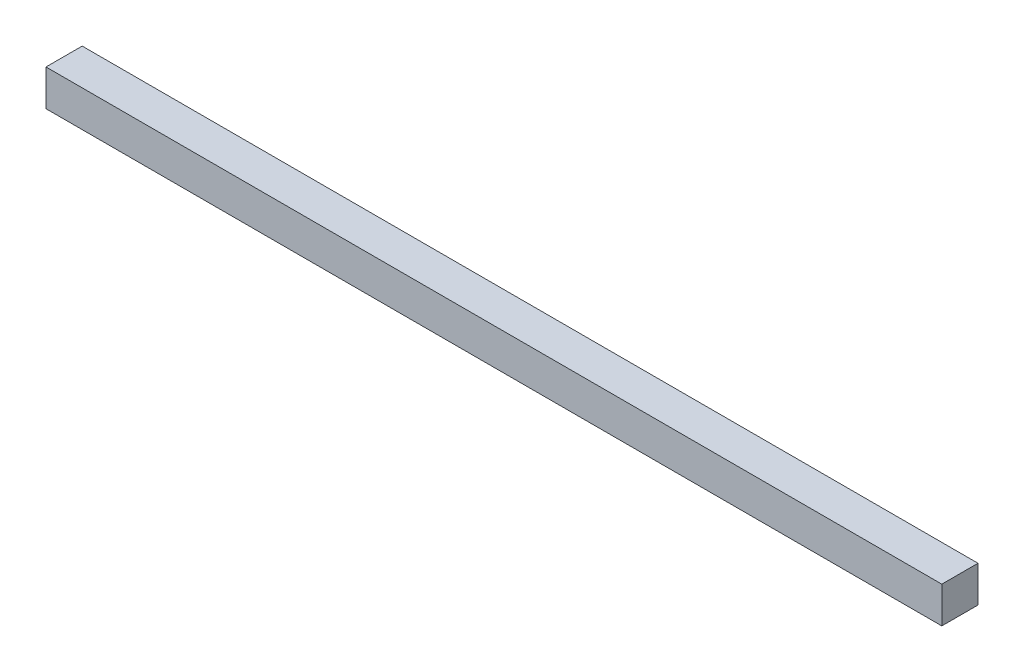
ISO-10303-21;
HEADER;
FILE_DESCRIPTION(('STEP AP214'),'2;1');
FILE_NAME('part.step','',(''),(''),'','','');
FILE_SCHEMA(('AUTOMOTIVE_DESIGN { 1 0 10303 214 1 1 1 1 }'));
ENDSEC;
DATA;
#1=APPLICATION_CONTEXT('core data for automotive mechanical design processes');
#2=APPLICATION_PROTOCOL_DEFINITION('international standard','automotive_design',2000,#1);
#3=PRODUCT_CONTEXT('',#1,'mechanical');
#4=PRODUCT('Part','Part','',(#3));
#5=PRODUCT_RELATED_PRODUCT_CATEGORY('part','',(#4));
#6=PRODUCT_DEFINITION_FORMATION('','',#4);
#7=PRODUCT_DEFINITION_CONTEXT('part definition',#1,'design');
#8=PRODUCT_DEFINITION('design','',#6,#7);
#9=PRODUCT_DEFINITION_SHAPE('','',#8);
#10=(LENGTH_UNIT() NAMED_UNIT(*) SI_UNIT(.MILLI.,.METRE.));
#11=(NAMED_UNIT(*) PLANE_ANGLE_UNIT() SI_UNIT($,.RADIAN.));
#12=(NAMED_UNIT(*) SI_UNIT($,.STERADIAN.) SOLID_ANGLE_UNIT());
#13=UNCERTAINTY_MEASURE_WITH_UNIT(LENGTH_MEASURE(1.E-05),#10,'distance_accuracy_value','');
#14=(GEOMETRIC_REPRESENTATION_CONTEXT(3) GLOBAL_UNCERTAINTY_ASSIGNED_CONTEXT((#13)) GLOBAL_UNIT_ASSIGNED_CONTEXT((#10,
#11,#12)) REPRESENTATION_CONTEXT('',''));
#15=CARTESIAN_POINT('',(0.,0.,0.));
#16=DIRECTION('',(0.,0.,1.));
#17=DIRECTION('',(1.,0.,0.));
#18=AXIS2_PLACEMENT_3D('',#15,#16,#17);
#19=CARTESIAN_POINT('',(-74.4664407274658,33.3500010619939,-10.));
#20=DIRECTION('',(-1.,0.,0.));
#21=DIRECTION('',(0.,0.,1.));
#22=AXIS2_PLACEMENT_3D('',#19,#20,#21);
#23=PLANE('',#22);
#24=DIRECTION('',(0.,0.,1.));
#25=VECTOR('',#24,1.);
#26=CARTESIAN_POINT('',(-74.4664407274658,13.3500010619939,-10.));
#27=LINE('',#26,#25);
#28=CARTESIAN_POINT('',(-74.4664407274658,13.3500010619939,-10.));
#29=VERTEX_POINT('',#28);
#30=CARTESIAN_POINT('',(-74.4664407274658,13.3500010619939,10.));
#31=VERTEX_POINT('',#30);
#32=EDGE_CURVE('E38',#29,#31,#27,.T.);
#33=ORIENTED_EDGE('',*,*,#32,.T.);
#34=DIRECTION('',(0.,-1.,0.));
#35=VECTOR('',#34,1.);
#36=CARTESIAN_POINT('',(-74.4664407274658,33.3500010619939,10.));
#37=LINE('',#36,#35);
#38=CARTESIAN_POINT('',(-74.4664407274658,33.3500010619939,10.));
#39=VERTEX_POINT('',#38);
#40=EDGE_CURVE('E75',#39,#31,#37,.T.);
#41=ORIENTED_EDGE('',*,*,#40,.F.);
#42=DIRECTION('',(0.,0.,1.));
#43=VECTOR('',#42,1.);
#44=CARTESIAN_POINT('',(-74.4664407274658,33.3500010619939,-10.));
#45=LINE('',#44,#43);
#46=CARTESIAN_POINT('',(-74.4664407274658,33.3500010619939,-10.));
#47=VERTEX_POINT('',#46);
#48=EDGE_CURVE('E11',#47,#39,#45,.T.);
#49=ORIENTED_EDGE('',*,*,#48,.F.);
#50=DIRECTION('',(0.,-1.,0.));
#51=VECTOR('',#50,1.);
#52=CARTESIAN_POINT('',(-74.4664407274658,33.3500010619939,-10.));
#53=LINE('',#52,#51);
#54=EDGE_CURVE('E76',#47,#29,#53,.T.);
#55=ORIENTED_EDGE('',*,*,#54,.T.);
#56=EDGE_LOOP('',(#33,#41,#49,#55));
#57=FACE_BOUND('',#56,.T.);
#58=ADVANCED_FACE('F35',(#57),#23,.T.);
#59=CARTESIAN_POINT('',(-74.4664407274658,33.3500010619939,-10.));
#60=DIRECTION('',(0.,1.,0.));
#61=DIRECTION('',(0.,0.,1.));
#62=AXIS2_PLACEMENT_3D('',#59,#60,#61);
#63=PLANE('',#62);
#64=ORIENTED_EDGE('',*,*,#48,.T.);
#65=DIRECTION('',(-1.,0.,0.));
#66=VECTOR('',#65,1.);
#67=CARTESIAN_POINT('',(-74.4664407274658,33.3500010619939,10.));
#68=LINE('',#67,#66);
#69=CARTESIAN_POINT('',(420.533559272534,33.3500010619939,10.));
#70=VERTEX_POINT('',#69);
#71=EDGE_CURVE('E92',#70,#39,#68,.T.);
#72=ORIENTED_EDGE('',*,*,#71,.F.);
#73=DIRECTION('',(0.,0.,1.));
#74=VECTOR('',#73,1.);
#75=CARTESIAN_POINT('',(420.533559272534,33.3500010619939,-10.));
#76=LINE('',#75,#74);
#77=CARTESIAN_POINT('',(420.533559272534,33.3500010619939,-10.));
#78=VERTEX_POINT('',#77);
#79=EDGE_CURVE('E43',#78,#70,#76,.T.);
#80=ORIENTED_EDGE('',*,*,#79,.F.);
#81=DIRECTION('',(-1.,0.,0.));
#82=VECTOR('',#81,1.);
#83=CARTESIAN_POINT('',(-74.4664407274658,33.3500010619939,-10.));
#84=LINE('',#83,#82);
#85=EDGE_CURVE('E81',#78,#47,#84,.T.);
#86=ORIENTED_EDGE('',*,*,#85,.T.);
#87=EDGE_LOOP('',(#64,#72,#80,#86));
#88=FACE_BOUND('',#87,.T.);
#89=ADVANCED_FACE('F107',(#88),#63,.T.);
#90=CARTESIAN_POINT('',(420.533559272534,33.3500010619939,-10.));
#91=DIRECTION('',(1.,0.,0.));
#92=DIRECTION('',(0.,0.,-1.));
#93=AXIS2_PLACEMENT_3D('',#90,#91,#92);
#94=PLANE('',#93);
#95=ORIENTED_EDGE('',*,*,#79,.T.);
#96=DIRECTION('',(0.,1.,0.));
#97=VECTOR('',#96,1.);
#98=CARTESIAN_POINT('',(420.533559272534,33.3500010619939,10.));
#99=LINE('',#98,#97);
#100=CARTESIAN_POINT('',(420.533559272534,13.3500010619939,10.));
#101=VERTEX_POINT('',#100);
#102=EDGE_CURVE('E88',#101,#70,#99,.T.);
#103=ORIENTED_EDGE('',*,*,#102,.F.);
#104=DIRECTION('',(0.,0.,1.));
#105=VECTOR('',#104,1.);
#106=CARTESIAN_POINT('',(420.533559272534,13.3500010619939,-10.));
#107=LINE('',#106,#105);
#108=CARTESIAN_POINT('',(420.533559272534,13.3500010619939,-10.));
#109=VERTEX_POINT('',#108);
#110=EDGE_CURVE('E80',#109,#101,#107,.T.);
#111=ORIENTED_EDGE('',*,*,#110,.F.);
#112=DIRECTION('',(0.,1.,0.));
#113=VECTOR('',#112,1.);
#114=CARTESIAN_POINT('',(420.533559272534,33.3500010619939,-10.));
#115=LINE('',#114,#113);
#116=EDGE_CURVE('E100',#109,#78,#115,.T.);
#117=ORIENTED_EDGE('',*,*,#116,.T.);
#118=EDGE_LOOP('',(#95,#103,#111,#117));
#119=FACE_BOUND('',#118,.T.);
#120=ADVANCED_FACE('F104',(#119),#94,.T.);
#121=CARTESIAN_POINT('',(-74.4664407274658,13.3500010619939,-10.));
#122=DIRECTION('',(0.,-1.,0.));
#123=DIRECTION('',(0.,0.,-1.));
#124=AXIS2_PLACEMENT_3D('',#121,#122,#123);
#125=PLANE('',#124);
#126=ORIENTED_EDGE('',*,*,#110,.T.);
#127=DIRECTION('',(1.,0.,0.));
#128=VECTOR('',#127,1.);
#129=CARTESIAN_POINT('',(-74.4664407274658,13.3500010619939,10.));
#130=LINE('',#129,#128);
#131=EDGE_CURVE('E83',#31,#101,#130,.T.);
#132=ORIENTED_EDGE('',*,*,#131,.F.);
#133=ORIENTED_EDGE('',*,*,#32,.F.);
#134=DIRECTION('',(1.,0.,0.));
#135=VECTOR('',#134,1.);
#136=CARTESIAN_POINT('',(-74.4664407274658,13.3500010619939,-10.));
#137=LINE('',#136,#135);
#138=EDGE_CURVE('E98',#29,#109,#137,.T.);
#139=ORIENTED_EDGE('',*,*,#138,.T.);
#140=EDGE_LOOP('',(#126,#132,#133,#139));
#141=FACE_BOUND('',#140,.T.);
#142=ADVANCED_FACE('F84',(#141),#125,.T.);
#143=CARTESIAN_POINT('',(0.,0.,-10.));
#144=DIRECTION('',(0.,0.,1.));
#145=DIRECTION('',(1.,0.,0.));
#146=AXIS2_PLACEMENT_3D('',#143,#144,#145);
#147=PLANE('',#146);
#148=ORIENTED_EDGE('',*,*,#54,.F.);
#149=ORIENTED_EDGE('',*,*,#85,.F.);
#150=ORIENTED_EDGE('',*,*,#116,.F.);
#151=ORIENTED_EDGE('',*,*,#138,.F.);
#152=EDGE_LOOP('',(#148,#149,#150,#151));
#153=FACE_BOUND('',#152,.T.);
#154=ADVANCED_FACE('F109',(#153),#147,.F.);
#155=CARTESIAN_POINT('',(0.,0.,10.));
#156=DIRECTION('',(0.,0.,1.));
#157=DIRECTION('',(1.,0.,0.));
#158=AXIS2_PLACEMENT_3D('',#155,#156,#157);
#159=PLANE('',#158);
#160=ORIENTED_EDGE('',*,*,#40,.T.);
#161=ORIENTED_EDGE('',*,*,#131,.T.);
#162=ORIENTED_EDGE('',*,*,#102,.T.);
#163=ORIENTED_EDGE('',*,*,#71,.T.);
#164=EDGE_LOOP('',(#160,#161,#162,#163));
#165=FACE_BOUND('',#164,.T.);
#166=ADVANCED_FACE('F91',(#165),#159,.T.);
#167=CLOSED_SHELL('',(#58,#89,#120,#142,#154,#166));
#168=MANIFOLD_SOLID_BREP('B2',#167);
#169=ADVANCED_BREP_SHAPE_REPRESENTATION('',(#18,#168),#14);
#170=SHAPE_DEFINITION_REPRESENTATION(#9,#169);
ENDSEC;
END-ISO-10303-21;
